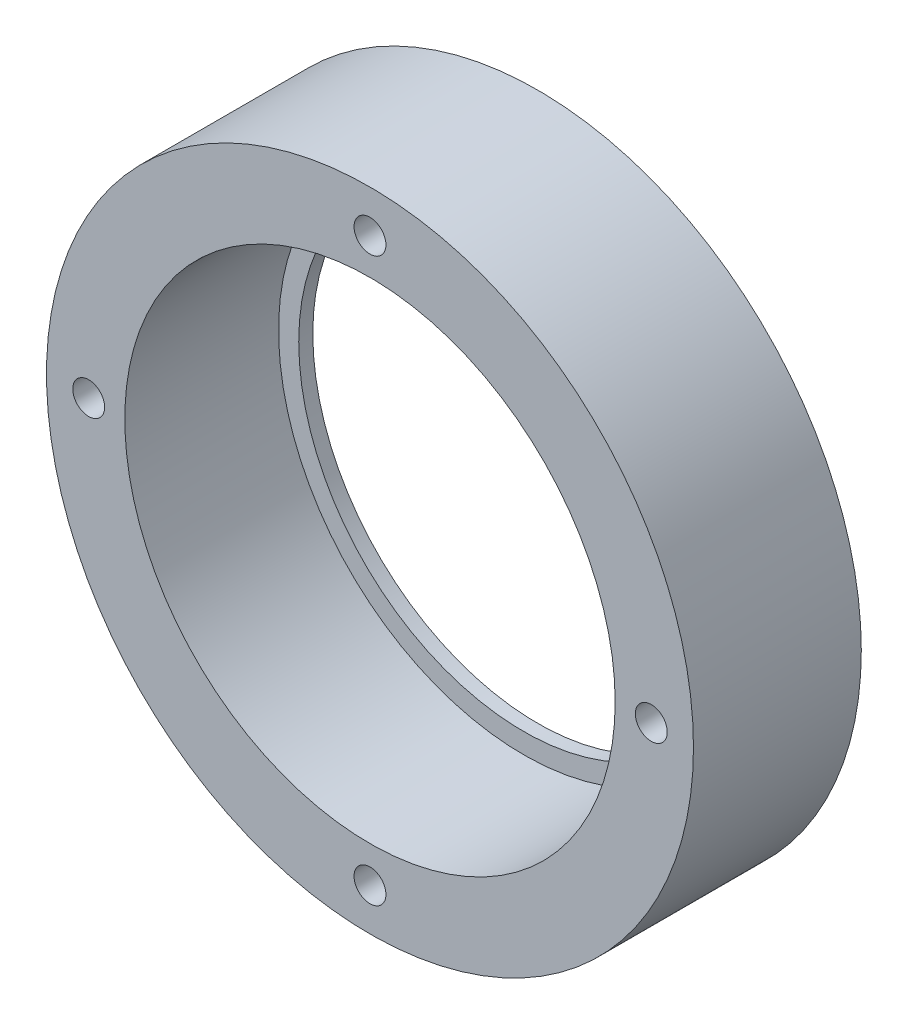
ISO-10303-21;
HEADER;
FILE_DESCRIPTION(('STEP AP214'),'2;1');
FILE_NAME('part.step','',(''),(''),'','','');
FILE_SCHEMA(('AUTOMOTIVE_DESIGN { 1 0 10303 214 1 1 1 1 }'));
ENDSEC;
DATA;
#1=APPLICATION_CONTEXT('core data for automotive mechanical design processes');
#2=APPLICATION_PROTOCOL_DEFINITION('international standard','automotive_design',2000,#1);
#3=PRODUCT_CONTEXT('',#1,'mechanical');
#4=PRODUCT('Part','Part','',(#3));
#5=PRODUCT_RELATED_PRODUCT_CATEGORY('part','',(#4));
#6=PRODUCT_DEFINITION_FORMATION('','',#4);
#7=PRODUCT_DEFINITION_CONTEXT('part definition',#1,'design');
#8=PRODUCT_DEFINITION('design','',#6,#7);
#9=PRODUCT_DEFINITION_SHAPE('','',#8);
#10=(LENGTH_UNIT() NAMED_UNIT(*) SI_UNIT(.MILLI.,.METRE.));
#11=(NAMED_UNIT(*) PLANE_ANGLE_UNIT() SI_UNIT($,.RADIAN.));
#12=(NAMED_UNIT(*) SI_UNIT($,.STERADIAN.) SOLID_ANGLE_UNIT());
#13=UNCERTAINTY_MEASURE_WITH_UNIT(LENGTH_MEASURE(1.E-05),#10,'distance_accuracy_value','');
#14=(GEOMETRIC_REPRESENTATION_CONTEXT(3) GLOBAL_UNCERTAINTY_ASSIGNED_CONTEXT((#13)) GLOBAL_UNIT_ASSIGNED_CONTEXT((#10,
#11,#12)) REPRESENTATION_CONTEXT('',''));
#15=CARTESIAN_POINT('',(0.,0.,0.));
#16=DIRECTION('',(0.,0.,1.));
#17=DIRECTION('',(1.,0.,0.));
#18=AXIS2_PLACEMENT_3D('',#15,#16,#17);
#19=CARTESIAN_POINT('',(0.,0.,1.5));
#20=DIRECTION('',(0.,0.,1.));
#21=DIRECTION('',(1.,0.,0.));
#22=AXIS2_PLACEMENT_3D('',#19,#20,#21);
#23=PLANE('',#22);
#24=CARTESIAN_POINT('',(0.,0.,1.5));
#25=DIRECTION('',(0.,0.,1.));
#26=DIRECTION('',(1.,0.,0.));
#27=AXIS2_PLACEMENT_3D('',#24,#25,#26);
#28=CIRCLE('',#27,24.);
#29=CARTESIAN_POINT('',(24.,0.,1.5));
#30=VERTEX_POINT('',#29);
#31=EDGE_CURVE('E80',#30,#30,#28,.T.);
#32=ORIENTED_EDGE('',*,*,#31,.F.);
#33=EDGE_LOOP('',(#32));
#34=FACE_BOUND('',#33,.T.);
#35=CARTESIAN_POINT('',(0.,0.,1.5));
#36=DIRECTION('',(0.,0.,1.));
#37=DIRECTION('',(1.,0.,0.));
#38=AXIS2_PLACEMENT_3D('',#35,#36,#37);
#39=CIRCLE('',#38,26.15);
#40=CARTESIAN_POINT('',(26.15,0.,1.5));
#41=VERTEX_POINT('',#40);
#42=EDGE_CURVE('E87',#41,#41,#39,.T.);
#43=ORIENTED_EDGE('',*,*,#42,.T.);
#44=EDGE_LOOP('',(#43));
#45=FACE_BOUND('',#44,.T.);
#46=ADVANCED_FACE('F41',(#34,#45),#23,.T.);
#47=CARTESIAN_POINT('',(0.,0.,0.));
#48=DIRECTION('',(0.,0.,1.));
#49=DIRECTION('',(1.,0.,0.));
#50=AXIS2_PLACEMENT_3D('',#47,#48,#49);
#51=PLANE('',#50);
#52=CARTESIAN_POINT('',(0.,-30.,0.));
#53=DIRECTION('',(0.,0.,1.));
#54=DIRECTION('',(1.,0.,0.));
#55=AXIS2_PLACEMENT_3D('',#52,#53,#54);
#56=CIRCLE('',#55,2.09999999999996);
#57=CARTESIAN_POINT('',(2.09999999999996,-30.,0.));
#58=VERTEX_POINT('',#57);
#59=EDGE_CURVE('E65',#58,#58,#56,.T.);
#60=ORIENTED_EDGE('',*,*,#59,.T.);
#61=EDGE_LOOP('',(#60));
#62=FACE_BOUND('',#61,.T.);
#63=CARTESIAN_POINT('',(30.,0.,0.));
#64=DIRECTION('',(0.,0.,1.));
#65=DIRECTION('',(1.,0.,0.));
#66=AXIS2_PLACEMENT_3D('',#63,#64,#65);
#67=CIRCLE('',#66,2.09999999999996);
#68=CARTESIAN_POINT('',(32.1,0.,0.));
#69=VERTEX_POINT('',#68);
#70=EDGE_CURVE('E63',#69,#69,#67,.T.);
#71=ORIENTED_EDGE('',*,*,#70,.T.);
#72=EDGE_LOOP('',(#71));
#73=FACE_BOUND('',#72,.T.);
#74=CARTESIAN_POINT('',(-30.,0.,0.));
#75=DIRECTION('',(0.,0.,1.));
#76=DIRECTION('',(1.,0.,0.));
#77=AXIS2_PLACEMENT_3D('',#74,#75,#76);
#78=CIRCLE('',#77,2.09999999999996);
#79=CARTESIAN_POINT('',(-27.9,0.,0.));
#80=VERTEX_POINT('',#79);
#81=EDGE_CURVE('E69',#80,#80,#78,.T.);
#82=ORIENTED_EDGE('',*,*,#81,.T.);
#83=EDGE_LOOP('',(#82));
#84=FACE_BOUND('',#83,.T.);
#85=CARTESIAN_POINT('',(0.,30.,0.));
#86=DIRECTION('',(0.,0.,1.));
#87=DIRECTION('',(1.,0.,0.));
#88=AXIS2_PLACEMENT_3D('',#85,#86,#87);
#89=CIRCLE('',#88,2.09999999999996);
#90=CARTESIAN_POINT('',(2.09999999999996,30.,0.));
#91=VERTEX_POINT('',#90);
#92=EDGE_CURVE('E73',#91,#91,#89,.T.);
#93=ORIENTED_EDGE('',*,*,#92,.T.);
#94=EDGE_LOOP('',(#93));
#95=FACE_BOUND('',#94,.T.);
#96=CARTESIAN_POINT('',(0.,0.,0.));
#97=DIRECTION('',(0.,0.,1.));
#98=DIRECTION('',(1.,0.,0.));
#99=AXIS2_PLACEMENT_3D('',#96,#97,#98);
#100=CIRCLE('',#99,34.5);
#101=CARTESIAN_POINT('',(34.5,0.,0.));
#102=VERTEX_POINT('',#101);
#103=EDGE_CURVE('E75',#102,#102,#100,.T.);
#104=ORIENTED_EDGE('',*,*,#103,.F.);
#105=EDGE_LOOP('',(#104));
#106=FACE_BOUND('',#105,.T.);
#107=CARTESIAN_POINT('',(0.,0.,0.));
#108=DIRECTION('',(0.,0.,1.));
#109=DIRECTION('',(1.,0.,0.));
#110=AXIS2_PLACEMENT_3D('',#107,#108,#109);
#111=CIRCLE('',#110,24.);
#112=CARTESIAN_POINT('',(24.,0.,0.));
#113=VERTEX_POINT('',#112);
#114=EDGE_CURVE('E76',#113,#113,#111,.T.);
#115=ORIENTED_EDGE('',*,*,#114,.T.);
#116=EDGE_LOOP('',(#115));
#117=FACE_BOUND('',#116,.T.);
#118=ADVANCED_FACE('F128',(#62,#73,#84,#95,#106,#117),#51,.F.);
#119=CARTESIAN_POINT('',(0.,0.,1.5));
#120=DIRECTION('',(0.,0.,-1.));
#121=DIRECTION('',(-1.,0.,0.));
#122=AXIS2_PLACEMENT_3D('',#119,#120,#121);
#123=CYLINDRICAL_SURFACE('',#122,34.5);
#124=ORIENTED_EDGE('',*,*,#103,.T.);
#125=EDGE_LOOP('',(#124));
#126=FACE_BOUND('',#125,.T.);
#127=CARTESIAN_POINT('',(0.,0.,17.9));
#128=DIRECTION('',(0.,0.,1.));
#129=DIRECTION('',(1.,0.,0.));
#130=AXIS2_PLACEMENT_3D('',#127,#128,#129);
#131=CIRCLE('',#130,34.5);
#132=CARTESIAN_POINT('',(34.5,0.,17.9));
#133=VERTEX_POINT('',#132);
#134=EDGE_CURVE('E82',#133,#133,#131,.T.);
#135=ORIENTED_EDGE('',*,*,#134,.F.);
#136=EDGE_LOOP('',(#135));
#137=FACE_BOUND('',#136,.T.);
#138=ADVANCED_FACE('F137',(#126,#137),#123,.T.);
#139=CARTESIAN_POINT('',(0.,0.,1.5));
#140=DIRECTION('',(0.,0.,-1.));
#141=DIRECTION('',(-1.,0.,0.));
#142=AXIS2_PLACEMENT_3D('',#139,#140,#141);
#143=CYLINDRICAL_SURFACE('',#142,24.);
#144=ORIENTED_EDGE('',*,*,#31,.T.);
#145=EDGE_LOOP('',(#144));
#146=FACE_BOUND('',#145,.T.);
#147=ORIENTED_EDGE('',*,*,#114,.F.);
#148=EDGE_LOOP('',(#147));
#149=FACE_BOUND('',#148,.T.);
#150=ADVANCED_FACE('F111',(#146,#149),#143,.F.);
#151=CARTESIAN_POINT('',(0.,0.,17.9));
#152=DIRECTION('',(0.,0.,1.));
#153=DIRECTION('',(1.,0.,0.));
#154=AXIS2_PLACEMENT_3D('',#151,#152,#153);
#155=PLANE('',#154);
#156=CARTESIAN_POINT('',(0.,30.,17.9));
#157=DIRECTION('',(0.,0.,1.));
#158=DIRECTION('',(1.,0.,0.));
#159=AXIS2_PLACEMENT_3D('',#156,#157,#158);
#160=CIRCLE('',#159,1.7);
#161=CARTESIAN_POINT('',(1.7,30.,17.9));
#162=VERTEX_POINT('',#161);
#163=EDGE_CURVE('E90',#162,#162,#160,.T.);
#164=ORIENTED_EDGE('',*,*,#163,.F.);
#165=EDGE_LOOP('',(#164));
#166=FACE_BOUND('',#165,.T.);
#167=CARTESIAN_POINT('',(30.,0.,17.9));
#168=DIRECTION('',(0.,0.,1.));
#169=DIRECTION('',(1.,0.,0.));
#170=AXIS2_PLACEMENT_3D('',#167,#168,#169);
#171=CIRCLE('',#170,1.7);
#172=CARTESIAN_POINT('',(31.7,0.,17.9));
#173=VERTEX_POINT('',#172);
#174=EDGE_CURVE('E100',#173,#173,#171,.T.);
#175=ORIENTED_EDGE('',*,*,#174,.F.);
#176=EDGE_LOOP('',(#175));
#177=FACE_BOUND('',#176,.T.);
#178=CARTESIAN_POINT('',(0.,-30.,17.9));
#179=DIRECTION('',(0.,0.,1.));
#180=DIRECTION('',(1.,0.,0.));
#181=AXIS2_PLACEMENT_3D('',#178,#179,#180);
#182=CIRCLE('',#181,1.7);
#183=CARTESIAN_POINT('',(1.7,-30.,17.9));
#184=VERTEX_POINT('',#183);
#185=EDGE_CURVE('E98',#184,#184,#182,.T.);
#186=ORIENTED_EDGE('',*,*,#185,.F.);
#187=EDGE_LOOP('',(#186));
#188=FACE_BOUND('',#187,.T.);
#189=CARTESIAN_POINT('',(-30.,0.,17.9));
#190=DIRECTION('',(0.,0.,1.));
#191=DIRECTION('',(1.,0.,0.));
#192=AXIS2_PLACEMENT_3D('',#189,#190,#191);
#193=CIRCLE('',#192,1.7);
#194=CARTESIAN_POINT('',(-28.3,0.,17.9));
#195=VERTEX_POINT('',#194);
#196=EDGE_CURVE('E92',#195,#195,#193,.T.);
#197=ORIENTED_EDGE('',*,*,#196,.F.);
#198=EDGE_LOOP('',(#197));
#199=FACE_BOUND('',#198,.T.);
#200=ORIENTED_EDGE('',*,*,#134,.T.);
#201=EDGE_LOOP('',(#200));
#202=FACE_BOUND('',#201,.T.);
#203=CARTESIAN_POINT('',(0.,0.,17.9));
#204=DIRECTION('',(0.,0.,1.));
#205=DIRECTION('',(1.,0.,0.));
#206=AXIS2_PLACEMENT_3D('',#203,#204,#205);
#207=CIRCLE('',#206,26.15);
#208=CARTESIAN_POINT('',(26.15,0.,17.9));
#209=VERTEX_POINT('',#208);
#210=EDGE_CURVE('E86',#209,#209,#207,.T.);
#211=ORIENTED_EDGE('',*,*,#210,.F.);
#212=EDGE_LOOP('',(#211));
#213=FACE_BOUND('',#212,.T.);
#214=ADVANCED_FACE('F110',(#166,#177,#188,#199,#202,#213),#155,.T.);
#215=CARTESIAN_POINT('',(0.,0.,17.9));
#216=DIRECTION('',(0.,0.,-1.));
#217=DIRECTION('',(-1.,0.,0.));
#218=AXIS2_PLACEMENT_3D('',#215,#216,#217);
#219=CYLINDRICAL_SURFACE('',#218,26.15);
#220=ORIENTED_EDGE('',*,*,#210,.T.);
#221=EDGE_LOOP('',(#220));
#222=FACE_BOUND('',#221,.T.);
#223=ORIENTED_EDGE('',*,*,#42,.F.);
#224=EDGE_LOOP('',(#223));
#225=FACE_BOUND('',#224,.T.);
#226=ADVANCED_FACE('F109',(#222,#225),#219,.F.);
#227=CARTESIAN_POINT('',(-30.,0.,0.));
#228=DIRECTION('',(0.,0.,1.));
#229=DIRECTION('',(1.,0.,0.));
#230=AXIS2_PLACEMENT_3D('',#227,#228,#229);
#231=CYLINDRICAL_SURFACE('',#230,1.7);
#232=CARTESIAN_POINT('',(-30.,0.,0.399999999999955));
#233=DIRECTION('',(0.,0.,1.));
#234=DIRECTION('',(1.,0.,0.));
#235=AXIS2_PLACEMENT_3D('',#232,#233,#234);
#236=CIRCLE('',#235,1.7);
#237=CARTESIAN_POINT('',(-28.3,0.,0.399999999999955));
#238=VERTEX_POINT('',#237);
#239=EDGE_CURVE('E47',#238,#238,#236,.F.);
#240=CARTESIAN_POINT('',(-28.3,0.,0.399999999999955));
#241=CARTESIAN_POINT('',(-28.3,0.,0.582291666666622));
#242=CARTESIAN_POINT('',(-28.3,0.,0.764583333333289));
#243=CARTESIAN_POINT('',(-28.3,0.,1.12916666666662));
#244=CARTESIAN_POINT('',(-28.3,0.,1.31145833333329));
#245=CARTESIAN_POINT('',(-28.3,0.,1.67604166666662));
#246=CARTESIAN_POINT('',(-28.3,0.,1.85833333333329));
#247=CARTESIAN_POINT('',(-28.3,0.,2.22291666666663));
#248=CARTESIAN_POINT('',(-28.3,0.,2.40520833333329));
#249=CARTESIAN_POINT('',(-28.3,0.,2.76979166666663));
#250=CARTESIAN_POINT('',(-28.3,0.,2.95208333333329));
#251=CARTESIAN_POINT('',(-28.3,0.,3.31666666666663));
#252=CARTESIAN_POINT('',(-28.3,0.,3.4989583333333));
#253=CARTESIAN_POINT('',(-28.3,0.,3.86354166666663));
#254=CARTESIAN_POINT('',(-28.3,0.,4.0458333333333));
#255=CARTESIAN_POINT('',(-28.3,0.,4.41041666666663));
#256=CARTESIAN_POINT('',(-28.3,0.,4.5927083333333));
#257=CARTESIAN_POINT('',(-28.3,0.,4.95729166666663));
#258=CARTESIAN_POINT('',(-28.3,0.,5.1395833333333));
#259=CARTESIAN_POINT('',(-28.3,0.,5.50416666666663));
#260=CARTESIAN_POINT('',(-28.3,0.,5.6864583333333));
#261=CARTESIAN_POINT('',(-28.3,0.,6.05104166666664));
#262=CARTESIAN_POINT('',(-28.3,0.,6.2333333333333));
#263=CARTESIAN_POINT('',(-28.3,0.,6.59791666666664));
#264=CARTESIAN_POINT('',(-28.3,0.,6.7802083333333));
#265=CARTESIAN_POINT('',(-28.3,0.,7.14479166666664));
#266=CARTESIAN_POINT('',(-28.3,0.,7.3270833333333));
#267=CARTESIAN_POINT('',(-28.3,0.,7.69166666666664));
#268=CARTESIAN_POINT('',(-28.3,0.,7.87395833333331));
#269=CARTESIAN_POINT('',(-28.3,0.,8.23854166666664));
#270=CARTESIAN_POINT('',(-28.3,0.,8.4208333333333));
#271=CARTESIAN_POINT('',(-28.3,0.,8.78541666666664));
#272=CARTESIAN_POINT('',(-28.3,0.,8.96770833333331));
#273=CARTESIAN_POINT('',(-28.3,0.,9.33229166666664));
#274=CARTESIAN_POINT('',(-28.3,0.,9.51458333333331));
#275=CARTESIAN_POINT('',(-28.3,0.,9.87916666666664));
#276=CARTESIAN_POINT('',(-28.3,0.,10.0614583333333));
#277=CARTESIAN_POINT('',(-28.3,0.,10.4260416666666));
#278=CARTESIAN_POINT('',(-28.3,0.,10.6083333333333));
#279=CARTESIAN_POINT('',(-28.3,0.,10.9729166666666));
#280=CARTESIAN_POINT('',(-28.3,0.,11.1552083333333));
#281=CARTESIAN_POINT('',(-28.3,0.,11.5197916666666));
#282=CARTESIAN_POINT('',(-28.3,0.,11.7020833333333));
#283=CARTESIAN_POINT('',(-28.3,0.,12.0666666666666));
#284=CARTESIAN_POINT('',(-28.3,0.,12.2489583333333));
#285=CARTESIAN_POINT('',(-28.3,0.,12.6135416666667));
#286=CARTESIAN_POINT('',(-28.3,0.,12.7958333333333));
#287=CARTESIAN_POINT('',(-28.3,0.,13.1604166666667));
#288=CARTESIAN_POINT('',(-28.3,0.,13.3427083333333));
#289=CARTESIAN_POINT('',(-28.3,0.,13.7072916666667));
#290=CARTESIAN_POINT('',(-28.3,0.,13.8895833333333));
#291=CARTESIAN_POINT('',(-28.3,0.,14.2541666666667));
#292=CARTESIAN_POINT('',(-28.3,0.,14.4364583333333));
#293=CARTESIAN_POINT('',(-28.3,0.,14.8010416666667));
#294=CARTESIAN_POINT('',(-28.3,0.,14.9833333333333));
#295=CARTESIAN_POINT('',(-28.3,0.,15.3479166666667));
#296=CARTESIAN_POINT('',(-28.3,0.,15.5302083333333));
#297=CARTESIAN_POINT('',(-28.3,0.,15.8947916666667));
#298=CARTESIAN_POINT('',(-28.3,0.,16.0770833333333));
#299=CARTESIAN_POINT('',(-28.3,0.,16.4416666666667));
#300=CARTESIAN_POINT('',(-28.3,0.,16.6239583333333));
#301=CARTESIAN_POINT('',(-28.3,0.,16.9885416666667));
#302=CARTESIAN_POINT('',(-28.3,0.,17.1708333333333));
#303=CARTESIAN_POINT('',(-28.3,0.,17.5354166666667));
#304=CARTESIAN_POINT('',(-28.3,0.,17.7177083333333));
#305=CARTESIAN_POINT('',(-28.3,0.,17.9));
#306=B_SPLINE_CURVE_WITH_KNOTS('',3,(#240,#241,#242,#243,#244,#245,#246,#247,#248,#249,#250,
#251,#252,#253,#254,#255,#256,#257,#258,#259,#260,#261,#262,#263,#264,#265,#266,#267,#268,#269,
#270,#271,#272,#273,#274,#275,#276,#277,#278,#279,#280,#281,#282,#283,#284,#285,#286,#287,#288,
#289,#290,#291,#292,#293,#294,#295,#296,#297,#298,#299,#300,#301,#302,#303,#304,#305),
.UNSPECIFIED.,.F.,.F.,(4,2,2,2,2,2,2,2,2,2,2,2,2,2,2,2,2,2,2,2,2,2,2,2,2,2,2,2,2,2,2,2,4),(0.,
0.546875000000001,1.09375,1.640625,2.18750000000001,2.73437500000001,3.28125000000001,
3.82812500000001,4.37500000000001,4.92187500000001,5.46875000000001,6.01562500000002,
6.56250000000002,7.10937500000002,7.65625000000002,8.20312500000002,8.75000000000002,
9.29687500000002,9.84375000000002,10.390625,10.9375,11.484375,12.03125,12.578125,13.125,
13.671875,14.21875,14.765625,15.3125,15.859375,16.40625,16.953125,17.5),.UNSPECIFIED.);
#307=EDGE_CURVE('BSEAM123',#238,#195,#306,.T.);
#308=ORIENTED_EDGE('',*,*,#239,.T.);
#309=ORIENTED_EDGE('',*,*,#196,.T.);
#310=ORIENTED_EDGE('',*,*,#307,.T.);
#311=ORIENTED_EDGE('',*,*,#307,.F.);
#312=EDGE_LOOP('',(#308,#310,#309,#311));
#313=FACE_BOUND('',#312,.T.);
#314=ADVANCED_FACE('F123',(#313),#231,.F.);
#315=CARTESIAN_POINT('',(0.,-30.,0.));
#316=DIRECTION('',(0.,0.,1.));
#317=DIRECTION('',(1.,0.,0.));
#318=AXIS2_PLACEMENT_3D('',#315,#316,#317);
#319=CYLINDRICAL_SURFACE('',#318,1.7);
#320=CARTESIAN_POINT('',(0.,-30.,0.399999999999958));
#321=DIRECTION('',(0.,0.,1.));
#322=DIRECTION('',(1.,0.,0.));
#323=AXIS2_PLACEMENT_3D('',#320,#321,#322);
#324=CIRCLE('',#323,1.7);
#325=CARTESIAN_POINT('',(1.7,-30.,0.399999999999958));
#326=VERTEX_POINT('',#325);
#327=EDGE_CURVE('E60',#326,#326,#324,.F.);
#328=CARTESIAN_POINT('',(1.7,-30.,0.399999999999958));
#329=CARTESIAN_POINT('',(1.7,-30.,0.582291666666625));
#330=CARTESIAN_POINT('',(1.7,-30.,0.764583333333292));
#331=CARTESIAN_POINT('',(1.7,-30.,1.12916666666663));
#332=CARTESIAN_POINT('',(1.7,-30.,1.31145833333329));
#333=CARTESIAN_POINT('',(1.7,-30.,1.67604166666663));
#334=CARTESIAN_POINT('',(1.7,-30.,1.85833333333329));
#335=CARTESIAN_POINT('',(1.7,-30.,2.22291666666663));
#336=CARTESIAN_POINT('',(1.7,-30.,2.4052083333333));
#337=CARTESIAN_POINT('',(1.7,-30.,2.76979166666663));
#338=CARTESIAN_POINT('',(1.7,-30.,2.9520833333333));
#339=CARTESIAN_POINT('',(1.7,-30.,3.31666666666663));
#340=CARTESIAN_POINT('',(1.7,-30.,3.4989583333333));
#341=CARTESIAN_POINT('',(1.7,-30.,3.86354166666663));
#342=CARTESIAN_POINT('',(1.7,-30.,4.0458333333333));
#343=CARTESIAN_POINT('',(1.7,-30.,4.41041666666663));
#344=CARTESIAN_POINT('',(1.7,-30.,4.5927083333333));
#345=CARTESIAN_POINT('',(1.7,-30.,4.95729166666663));
#346=CARTESIAN_POINT('',(1.7,-30.,5.1395833333333));
#347=CARTESIAN_POINT('',(1.7,-30.,5.50416666666664));
#348=CARTESIAN_POINT('',(1.7,-30.,5.6864583333333));
#349=CARTESIAN_POINT('',(1.7,-30.,6.05104166666664));
#350=CARTESIAN_POINT('',(1.7,-30.,6.2333333333333));
#351=CARTESIAN_POINT('',(1.7,-30.,6.59791666666664));
#352=CARTESIAN_POINT('',(1.7,-30.,6.7802083333333));
#353=CARTESIAN_POINT('',(1.7,-30.,7.14479166666664));
#354=CARTESIAN_POINT('',(1.7,-30.,7.3270833333333));
#355=CARTESIAN_POINT('',(1.7,-30.,7.69166666666664));
#356=CARTESIAN_POINT('',(1.7,-30.,7.87395833333331));
#357=CARTESIAN_POINT('',(1.7,-30.,8.23854166666664));
#358=CARTESIAN_POINT('',(1.7,-30.,8.42083333333331));
#359=CARTESIAN_POINT('',(1.7,-30.,8.78541666666664));
#360=CARTESIAN_POINT('',(1.7,-30.,8.96770833333331));
#361=CARTESIAN_POINT('',(1.7,-30.,9.33229166666664));
#362=CARTESIAN_POINT('',(1.7,-30.,9.51458333333331));
#363=CARTESIAN_POINT('',(1.7,-30.,9.87916666666664));
#364=CARTESIAN_POINT('',(1.7,-30.,10.0614583333333));
#365=CARTESIAN_POINT('',(1.7,-30.,10.4260416666666));
#366=CARTESIAN_POINT('',(1.7,-30.,10.6083333333333));
#367=CARTESIAN_POINT('',(1.7,-30.,10.9729166666666));
#368=CARTESIAN_POINT('',(1.7,-30.,11.1552083333333));
#369=CARTESIAN_POINT('',(1.7,-30.,11.5197916666666));
#370=CARTESIAN_POINT('',(1.7,-30.,11.7020833333333));
#371=CARTESIAN_POINT('',(1.7,-30.,12.0666666666666));
#372=CARTESIAN_POINT('',(1.7,-30.,12.2489583333333));
#373=CARTESIAN_POINT('',(1.7,-30.,12.6135416666667));
#374=CARTESIAN_POINT('',(1.7,-30.,12.7958333333333));
#375=CARTESIAN_POINT('',(1.7,-30.,13.1604166666667));
#376=CARTESIAN_POINT('',(1.7,-30.,13.3427083333333));
#377=CARTESIAN_POINT('',(1.7,-30.,13.7072916666667));
#378=CARTESIAN_POINT('',(1.7,-30.,13.8895833333333));
#379=CARTESIAN_POINT('',(1.7,-30.,14.2541666666667));
#380=CARTESIAN_POINT('',(1.7,-30.,14.4364583333333));
#381=CARTESIAN_POINT('',(1.7,-30.,14.8010416666667));
#382=CARTESIAN_POINT('',(1.7,-30.,14.9833333333333));
#383=CARTESIAN_POINT('',(1.7,-30.,15.3479166666667));
#384=CARTESIAN_POINT('',(1.7,-30.,15.5302083333333));
#385=CARTESIAN_POINT('',(1.7,-30.,15.8947916666667));
#386=CARTESIAN_POINT('',(1.7,-30.,16.0770833333333));
#387=CARTESIAN_POINT('',(1.7,-30.,16.4416666666667));
#388=CARTESIAN_POINT('',(1.7,-30.,16.6239583333333));
#389=CARTESIAN_POINT('',(1.7,-30.,16.9885416666667));
#390=CARTESIAN_POINT('',(1.7,-30.,17.1708333333333));
#391=CARTESIAN_POINT('',(1.7,-30.,17.5354166666667));
#392=CARTESIAN_POINT('',(1.7,-30.,17.7177083333333));
#393=CARTESIAN_POINT('',(1.7,-30.,17.9));
#394=B_SPLINE_CURVE_WITH_KNOTS('',3,(#328,#329,#330,#331,#332,#333,#334,#335,#336,#337,#338,
#339,#340,#341,#342,#343,#344,#345,#346,#347,#348,#349,#350,#351,#352,#353,#354,#355,#356,#357,
#358,#359,#360,#361,#362,#363,#364,#365,#366,#367,#368,#369,#370,#371,#372,#373,#374,#375,#376,
#377,#378,#379,#380,#381,#382,#383,#384,#385,#386,#387,#388,#389,#390,#391,#392,#393),
.UNSPECIFIED.,.F.,.F.,(4,2,2,2,2,2,2,2,2,2,2,2,2,2,2,2,2,2,2,2,2,2,2,2,2,2,2,2,2,2,2,2,4),(0.,
0.546875000000001,1.09375,1.640625,2.1875,2.73437500000001,3.28125000000001,3.82812500000001,
4.37500000000001,4.92187500000001,5.46875000000001,6.01562500000001,6.56250000000001,
7.10937500000002,7.65625000000002,8.20312500000002,8.75000000000002,9.29687500000002,
9.84375000000002,10.390625,10.9375,11.484375,12.03125,12.578125,13.125,13.671875,14.21875,
14.765625,15.3125,15.859375,16.40625,16.953125,17.5),.UNSPECIFIED.);
#395=EDGE_CURVE('BSEAM217',#326,#184,#394,.T.);
#396=ORIENTED_EDGE('',*,*,#327,.T.);
#397=ORIENTED_EDGE('',*,*,#185,.T.);
#398=ORIENTED_EDGE('',*,*,#395,.T.);
#399=ORIENTED_EDGE('',*,*,#395,.F.);
#400=EDGE_LOOP('',(#396,#398,#397,#399));
#401=FACE_BOUND('',#400,.T.);
#402=ADVANCED_FACE('F217',(#401),#319,.F.);
#403=CARTESIAN_POINT('',(30.,0.,0.));
#404=DIRECTION('',(0.,0.,1.));
#405=DIRECTION('',(1.,0.,0.));
#406=AXIS2_PLACEMENT_3D('',#403,#404,#405);
#407=CYLINDRICAL_SURFACE('',#406,1.7);
#408=CARTESIAN_POINT('',(30.,0.,0.399999999999955));
#409=DIRECTION('',(0.,0.,1.));
#410=DIRECTION('',(1.,0.,0.));
#411=AXIS2_PLACEMENT_3D('',#408,#409,#410);
#412=CIRCLE('',#411,1.7);
#413=CARTESIAN_POINT('',(31.7,0.,0.399999999999955));
#414=VERTEX_POINT('',#413);
#415=EDGE_CURVE('E52',#414,#414,#412,.F.);
#416=CARTESIAN_POINT('',(31.7,0.,0.399999999999955));
#417=CARTESIAN_POINT('',(31.7,0.,0.582291666666622));
#418=CARTESIAN_POINT('',(31.7,0.,0.764583333333289));
#419=CARTESIAN_POINT('',(31.7,0.,1.12916666666662));
#420=CARTESIAN_POINT('',(31.7,0.,1.31145833333329));
#421=CARTESIAN_POINT('',(31.7,0.,1.67604166666662));
#422=CARTESIAN_POINT('',(31.7,0.,1.85833333333329));
#423=CARTESIAN_POINT('',(31.7,0.,2.22291666666663));
#424=CARTESIAN_POINT('',(31.7,0.,2.40520833333329));
#425=CARTESIAN_POINT('',(31.7,0.,2.76979166666663));
#426=CARTESIAN_POINT('',(31.7,0.,2.95208333333329));
#427=CARTESIAN_POINT('',(31.7,0.,3.31666666666663));
#428=CARTESIAN_POINT('',(31.7,0.,3.4989583333333));
#429=CARTESIAN_POINT('',(31.7,0.,3.86354166666663));
#430=CARTESIAN_POINT('',(31.7,0.,4.0458333333333));
#431=CARTESIAN_POINT('',(31.7,0.,4.41041666666663));
#432=CARTESIAN_POINT('',(31.7,0.,4.5927083333333));
#433=CARTESIAN_POINT('',(31.7,0.,4.95729166666663));
#434=CARTESIAN_POINT('',(31.7,0.,5.1395833333333));
#435=CARTESIAN_POINT('',(31.7,0.,5.50416666666663));
#436=CARTESIAN_POINT('',(31.7,0.,5.6864583333333));
#437=CARTESIAN_POINT('',(31.7,0.,6.05104166666664));
#438=CARTESIAN_POINT('',(31.7,0.,6.2333333333333));
#439=CARTESIAN_POINT('',(31.7,0.,6.59791666666664));
#440=CARTESIAN_POINT('',(31.7,0.,6.7802083333333));
#441=CARTESIAN_POINT('',(31.7,0.,7.14479166666664));
#442=CARTESIAN_POINT('',(31.7,0.,7.3270833333333));
#443=CARTESIAN_POINT('',(31.7,0.,7.69166666666664));
#444=CARTESIAN_POINT('',(31.7,0.,7.87395833333331));
#445=CARTESIAN_POINT('',(31.7,0.,8.23854166666664));
#446=CARTESIAN_POINT('',(31.7,0.,8.4208333333333));
#447=CARTESIAN_POINT('',(31.7,0.,8.78541666666664));
#448=CARTESIAN_POINT('',(31.7,0.,8.96770833333331));
#449=CARTESIAN_POINT('',(31.7,0.,9.33229166666664));
#450=CARTESIAN_POINT('',(31.7,0.,9.51458333333331));
#451=CARTESIAN_POINT('',(31.7,0.,9.87916666666664));
#452=CARTESIAN_POINT('',(31.7,0.,10.0614583333333));
#453=CARTESIAN_POINT('',(31.7,0.,10.4260416666666));
#454=CARTESIAN_POINT('',(31.7,0.,10.6083333333333));
#455=CARTESIAN_POINT('',(31.7,0.,10.9729166666666));
#456=CARTESIAN_POINT('',(31.7,0.,11.1552083333333));
#457=CARTESIAN_POINT('',(31.7,0.,11.5197916666666));
#458=CARTESIAN_POINT('',(31.7,0.,11.7020833333333));
#459=CARTESIAN_POINT('',(31.7,0.,12.0666666666666));
#460=CARTESIAN_POINT('',(31.7,0.,12.2489583333333));
#461=CARTESIAN_POINT('',(31.7,0.,12.6135416666667));
#462=CARTESIAN_POINT('',(31.7,0.,12.7958333333333));
#463=CARTESIAN_POINT('',(31.7,0.,13.1604166666667));
#464=CARTESIAN_POINT('',(31.7,0.,13.3427083333333));
#465=CARTESIAN_POINT('',(31.7,0.,13.7072916666667));
#466=CARTESIAN_POINT('',(31.7,0.,13.8895833333333));
#467=CARTESIAN_POINT('',(31.7,0.,14.2541666666667));
#468=CARTESIAN_POINT('',(31.7,0.,14.4364583333333));
#469=CARTESIAN_POINT('',(31.7,0.,14.8010416666667));
#470=CARTESIAN_POINT('',(31.7,0.,14.9833333333333));
#471=CARTESIAN_POINT('',(31.7,0.,15.3479166666667));
#472=CARTESIAN_POINT('',(31.7,0.,15.5302083333333));
#473=CARTESIAN_POINT('',(31.7,0.,15.8947916666667));
#474=CARTESIAN_POINT('',(31.7,0.,16.0770833333333));
#475=CARTESIAN_POINT('',(31.7,0.,16.4416666666667));
#476=CARTESIAN_POINT('',(31.7,0.,16.6239583333333));
#477=CARTESIAN_POINT('',(31.7,0.,16.9885416666667));
#478=CARTESIAN_POINT('',(31.7,0.,17.1708333333333));
#479=CARTESIAN_POINT('',(31.7,0.,17.5354166666667));
#480=CARTESIAN_POINT('',(31.7,0.,17.7177083333333));
#481=CARTESIAN_POINT('',(31.7,0.,17.9));
#482=B_SPLINE_CURVE_WITH_KNOTS('',3,(#416,#417,#418,#419,#420,#421,#422,#423,#424,#425,#426,
#427,#428,#429,#430,#431,#432,#433,#434,#435,#436,#437,#438,#439,#440,#441,#442,#443,#444,#445,
#446,#447,#448,#449,#450,#451,#452,#453,#454,#455,#456,#457,#458,#459,#460,#461,#462,#463,#464,
#465,#466,#467,#468,#469,#470,#471,#472,#473,#474,#475,#476,#477,#478,#479,#480,#481),
.UNSPECIFIED.,.F.,.F.,(4,2,2,2,2,2,2,2,2,2,2,2,2,2,2,2,2,2,2,2,2,2,2,2,2,2,2,2,2,2,2,2,4),(0.,
0.546875000000001,1.09375,1.640625,2.18750000000001,2.73437500000001,3.28125000000001,
3.82812500000001,4.37500000000001,4.92187500000001,5.46875000000001,6.01562500000002,
6.56250000000002,7.10937500000002,7.65625000000002,8.20312500000002,8.75000000000002,
9.29687500000002,9.84375000000002,10.390625,10.9375,11.484375,12.03125,12.578125,13.125,
13.671875,14.21875,14.765625,15.3125,15.859375,16.40625,16.953125,17.5),.UNSPECIFIED.);
#483=EDGE_CURVE('BSEAM228',#414,#173,#482,.T.);
#484=ORIENTED_EDGE('',*,*,#415,.T.);
#485=ORIENTED_EDGE('',*,*,#174,.T.);
#486=ORIENTED_EDGE('',*,*,#483,.T.);
#487=ORIENTED_EDGE('',*,*,#483,.F.);
#488=EDGE_LOOP('',(#484,#486,#485,#487));
#489=FACE_BOUND('',#488,.T.);
#490=ADVANCED_FACE('F228',(#489),#407,.F.);
#491=CARTESIAN_POINT('',(0.,30.,0.));
#492=DIRECTION('',(0.,0.,1.));
#493=DIRECTION('',(1.,0.,0.));
#494=AXIS2_PLACEMENT_3D('',#491,#492,#493);
#495=CYLINDRICAL_SURFACE('',#494,1.7);
#496=CARTESIAN_POINT('',(0.,30.,0.399999999999958));
#497=DIRECTION('',(0.,0.,1.));
#498=DIRECTION('',(1.,0.,0.));
#499=AXIS2_PLACEMENT_3D('',#496,#497,#498);
#500=CIRCLE('',#499,1.7);
#501=CARTESIAN_POINT('',(1.7,30.,0.399999999999958));
#502=VERTEX_POINT('',#501);
#503=EDGE_CURVE('E10',#502,#502,#500,.F.);
#504=CARTESIAN_POINT('',(1.7,30.,0.399999999999958));
#505=CARTESIAN_POINT('',(1.7,30.,0.582291666666625));
#506=CARTESIAN_POINT('',(1.7,30.,0.764583333333292));
#507=CARTESIAN_POINT('',(1.7,30.,1.12916666666663));
#508=CARTESIAN_POINT('',(1.7,30.,1.31145833333329));
#509=CARTESIAN_POINT('',(1.7,30.,1.67604166666663));
#510=CARTESIAN_POINT('',(1.7,30.,1.85833333333329));
#511=CARTESIAN_POINT('',(1.7,30.,2.22291666666663));
#512=CARTESIAN_POINT('',(1.7,30.,2.4052083333333));
#513=CARTESIAN_POINT('',(1.7,30.,2.76979166666663));
#514=CARTESIAN_POINT('',(1.7,30.,2.9520833333333));
#515=CARTESIAN_POINT('',(1.7,30.,3.31666666666663));
#516=CARTESIAN_POINT('',(1.7,30.,3.4989583333333));
#517=CARTESIAN_POINT('',(1.7,30.,3.86354166666663));
#518=CARTESIAN_POINT('',(1.7,30.,4.0458333333333));
#519=CARTESIAN_POINT('',(1.7,30.,4.41041666666663));
#520=CARTESIAN_POINT('',(1.7,30.,4.5927083333333));
#521=CARTESIAN_POINT('',(1.7,30.,4.95729166666663));
#522=CARTESIAN_POINT('',(1.7,30.,5.1395833333333));
#523=CARTESIAN_POINT('',(1.7,30.,5.50416666666664));
#524=CARTESIAN_POINT('',(1.7,30.,5.6864583333333));
#525=CARTESIAN_POINT('',(1.7,30.,6.05104166666664));
#526=CARTESIAN_POINT('',(1.7,30.,6.2333333333333));
#527=CARTESIAN_POINT('',(1.7,30.,6.59791666666664));
#528=CARTESIAN_POINT('',(1.7,30.,6.7802083333333));
#529=CARTESIAN_POINT('',(1.7,30.,7.14479166666664));
#530=CARTESIAN_POINT('',(1.7,30.,7.3270833333333));
#531=CARTESIAN_POINT('',(1.7,30.,7.69166666666664));
#532=CARTESIAN_POINT('',(1.7,30.,7.87395833333331));
#533=CARTESIAN_POINT('',(1.7,30.,8.23854166666664));
#534=CARTESIAN_POINT('',(1.7,30.,8.42083333333331));
#535=CARTESIAN_POINT('',(1.7,30.,8.78541666666664));
#536=CARTESIAN_POINT('',(1.7,30.,8.96770833333331));
#537=CARTESIAN_POINT('',(1.7,30.,9.33229166666664));
#538=CARTESIAN_POINT('',(1.7,30.,9.51458333333331));
#539=CARTESIAN_POINT('',(1.7,30.,9.87916666666664));
#540=CARTESIAN_POINT('',(1.7,30.,10.0614583333333));
#541=CARTESIAN_POINT('',(1.7,30.,10.4260416666666));
#542=CARTESIAN_POINT('',(1.7,30.,10.6083333333333));
#543=CARTESIAN_POINT('',(1.7,30.,10.9729166666666));
#544=CARTESIAN_POINT('',(1.7,30.,11.1552083333333));
#545=CARTESIAN_POINT('',(1.7,30.,11.5197916666666));
#546=CARTESIAN_POINT('',(1.7,30.,11.7020833333333));
#547=CARTESIAN_POINT('',(1.7,30.,12.0666666666666));
#548=CARTESIAN_POINT('',(1.7,30.,12.2489583333333));
#549=CARTESIAN_POINT('',(1.7,30.,12.6135416666667));
#550=CARTESIAN_POINT('',(1.7,30.,12.7958333333333));
#551=CARTESIAN_POINT('',(1.7,30.,13.1604166666667));
#552=CARTESIAN_POINT('',(1.7,30.,13.3427083333333));
#553=CARTESIAN_POINT('',(1.7,30.,13.7072916666667));
#554=CARTESIAN_POINT('',(1.7,30.,13.8895833333333));
#555=CARTESIAN_POINT('',(1.7,30.,14.2541666666667));
#556=CARTESIAN_POINT('',(1.7,30.,14.4364583333333));
#557=CARTESIAN_POINT('',(1.7,30.,14.8010416666667));
#558=CARTESIAN_POINT('',(1.7,30.,14.9833333333333));
#559=CARTESIAN_POINT('',(1.7,30.,15.3479166666667));
#560=CARTESIAN_POINT('',(1.7,30.,15.5302083333333));
#561=CARTESIAN_POINT('',(1.7,30.,15.8947916666667));
#562=CARTESIAN_POINT('',(1.7,30.,16.0770833333333));
#563=CARTESIAN_POINT('',(1.7,30.,16.4416666666667));
#564=CARTESIAN_POINT('',(1.7,30.,16.6239583333333));
#565=CARTESIAN_POINT('',(1.7,30.,16.9885416666667));
#566=CARTESIAN_POINT('',(1.7,30.,17.1708333333333));
#567=CARTESIAN_POINT('',(1.7,30.,17.5354166666667));
#568=CARTESIAN_POINT('',(1.7,30.,17.7177083333333));
#569=CARTESIAN_POINT('',(1.7,30.,17.9));
#570=B_SPLINE_CURVE_WITH_KNOTS('',3,(#504,#505,#506,#507,#508,#509,#510,#511,#512,#513,#514,
#515,#516,#517,#518,#519,#520,#521,#522,#523,#524,#525,#526,#527,#528,#529,#530,#531,#532,#533,
#534,#535,#536,#537,#538,#539,#540,#541,#542,#543,#544,#545,#546,#547,#548,#549,#550,#551,#552,
#553,#554,#555,#556,#557,#558,#559,#560,#561,#562,#563,#564,#565,#566,#567,#568,#569),
.UNSPECIFIED.,.F.,.F.,(4,2,2,2,2,2,2,2,2,2,2,2,2,2,2,2,2,2,2,2,2,2,2,2,2,2,2,2,2,2,2,2,4),(0.,
0.546875000000001,1.09375,1.640625,2.1875,2.73437500000001,3.28125000000001,3.82812500000001,
4.37500000000001,4.92187500000001,5.46875000000001,6.01562500000001,6.56250000000001,
7.10937500000002,7.65625000000002,8.20312500000002,8.75000000000002,9.29687500000002,
9.84375000000002,10.390625,10.9375,11.484375,12.03125,12.578125,13.125,13.671875,14.21875,
14.765625,15.3125,15.859375,16.40625,16.953125,17.5),.UNSPECIFIED.);
#571=EDGE_CURVE('BSEAM102',#502,#162,#570,.T.);
#572=ORIENTED_EDGE('',*,*,#503,.T.);
#573=ORIENTED_EDGE('',*,*,#163,.T.);
#574=ORIENTED_EDGE('',*,*,#571,.T.);
#575=ORIENTED_EDGE('',*,*,#571,.F.);
#576=EDGE_LOOP('',(#572,#574,#573,#575));
#577=FACE_BOUND('',#576,.T.);
#578=ADVANCED_FACE('F102',(#577),#495,.F.);
#579=CARTESIAN_POINT('',(0.,-30.,0.));
#580=DIRECTION('',(0.,0.,-1.));
#581=DIRECTION('',(-1.,0.,0.));
#582=AXIS2_PLACEMENT_3D('',#579,#580,#581);
#583=CONICAL_SURFACE('',#582,2.09999999999996,0.785398163397455);
#584=ORIENTED_EDGE('',*,*,#327,.F.);
#585=EDGE_LOOP('',(#584));
#586=FACE_BOUND('',#585,.T.);
#587=ORIENTED_EDGE('',*,*,#59,.F.);
#588=EDGE_LOOP('',(#587));
#589=FACE_BOUND('',#588,.T.);
#590=ADVANCED_FACE('F150',(#586,#589),#583,.F.);
#591=CARTESIAN_POINT('',(30.,0.,0.));
#592=DIRECTION('',(0.,0.,-1.));
#593=DIRECTION('',(-1.,0.,0.));
#594=AXIS2_PLACEMENT_3D('',#591,#592,#593);
#595=CONICAL_SURFACE('',#594,2.09999999999996,0.785398163397459);
#596=ORIENTED_EDGE('',*,*,#415,.F.);
#597=EDGE_LOOP('',(#596));
#598=FACE_BOUND('',#597,.T.);
#599=ORIENTED_EDGE('',*,*,#70,.F.);
#600=EDGE_LOOP('',(#599));
#601=FACE_BOUND('',#600,.T.);
#602=ADVANCED_FACE('F154',(#598,#601),#595,.F.);
#603=CARTESIAN_POINT('',(-30.,0.,0.));
#604=DIRECTION('',(0.,0.,-1.));
#605=DIRECTION('',(-1.,0.,0.));
#606=AXIS2_PLACEMENT_3D('',#603,#604,#605);
#607=CONICAL_SURFACE('',#606,2.09999999999996,0.785398163397459);
#608=ORIENTED_EDGE('',*,*,#239,.F.);
#609=EDGE_LOOP('',(#608));
#610=FACE_BOUND('',#609,.T.);
#611=ORIENTED_EDGE('',*,*,#81,.F.);
#612=EDGE_LOOP('',(#611));
#613=FACE_BOUND('',#612,.T.);
#614=ADVANCED_FACE('F160',(#610,#613),#607,.F.);
#615=CARTESIAN_POINT('',(0.,30.,0.));
#616=DIRECTION('',(0.,0.,-1.));
#617=DIRECTION('',(-1.,0.,0.));
#618=AXIS2_PLACEMENT_3D('',#615,#616,#617);
#619=CONICAL_SURFACE('',#618,2.09999999999996,0.785398163397455);
#620=ORIENTED_EDGE('',*,*,#503,.F.);
#621=EDGE_LOOP('',(#620));
#622=FACE_BOUND('',#621,.T.);
#623=ORIENTED_EDGE('',*,*,#92,.F.);
#624=EDGE_LOOP('',(#623));
#625=FACE_BOUND('',#624,.T.);
#626=ADVANCED_FACE('F42',(#622,#625),#619,.F.);
#627=CLOSED_SHELL('',(#46,#118,#138,#150,#214,#226,#314,#402,#490,#578,#590,#602,#614,#626));
#628=MANIFOLD_SOLID_BREP('B2',#627);
#629=ADVANCED_BREP_SHAPE_REPRESENTATION('',(#18,#628),#14);
#630=SHAPE_DEFINITION_REPRESENTATION(#9,#629);
ENDSEC;
END-ISO-10303-21;
